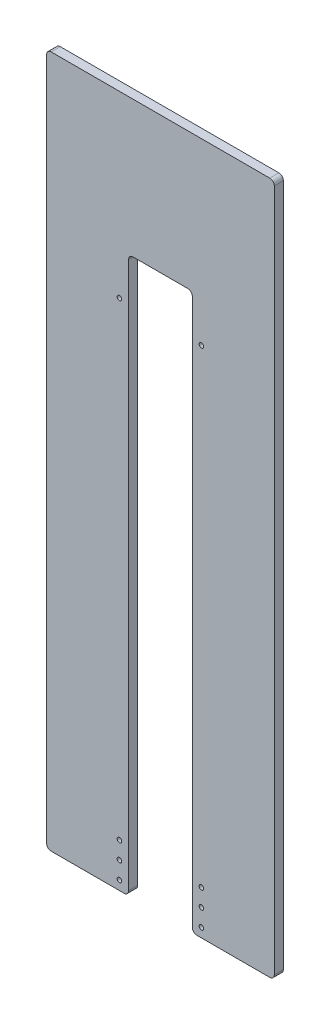
ISO-10303-21;
HEADER;
FILE_DESCRIPTION(('STEP AP214'),'2;1');
FILE_NAME('part.step','',(''),(''),'','','');
FILE_SCHEMA(('AUTOMOTIVE_DESIGN { 1 0 10303 214 1 1 1 1 }'));
ENDSEC;
DATA;
#1=APPLICATION_CONTEXT('core data for automotive mechanical design processes');
#2=APPLICATION_PROTOCOL_DEFINITION('international standard','automotive_design',2000,#1);
#3=PRODUCT_CONTEXT('',#1,'mechanical');
#4=PRODUCT('Part','Part','',(#3));
#5=PRODUCT_RELATED_PRODUCT_CATEGORY('part','',(#4));
#6=PRODUCT_DEFINITION_FORMATION('','',#4);
#7=PRODUCT_DEFINITION_CONTEXT('part definition',#1,'design');
#8=PRODUCT_DEFINITION('design','',#6,#7);
#9=PRODUCT_DEFINITION_SHAPE('','',#8);
#10=(LENGTH_UNIT() NAMED_UNIT(*) SI_UNIT(.MILLI.,.METRE.));
#11=(NAMED_UNIT(*) PLANE_ANGLE_UNIT() SI_UNIT($,.RADIAN.));
#12=(NAMED_UNIT(*) SI_UNIT($,.STERADIAN.) SOLID_ANGLE_UNIT());
#13=UNCERTAINTY_MEASURE_WITH_UNIT(LENGTH_MEASURE(1.E-05),#10,'distance_accuracy_value','');
#14=(GEOMETRIC_REPRESENTATION_CONTEXT(3) GLOBAL_UNCERTAINTY_ASSIGNED_CONTEXT((#13)) GLOBAL_UNIT_ASSIGNED_CONTEXT((#10,
#11,#12)) REPRESENTATION_CONTEXT('',''));
#15=CARTESIAN_POINT('',(0.,0.,0.));
#16=DIRECTION('',(0.,0.,1.));
#17=DIRECTION('',(1.,0.,0.));
#18=AXIS2_PLACEMENT_3D('',#15,#16,#17);
#19=CARTESIAN_POINT('',(40.,-5.,10.));
#20=DIRECTION('',(0.,0.,-1.));
#21=DIRECTION('',(-1.,0.,0.));
#22=AXIS2_PLACEMENT_3D('',#19,#20,#21);
#23=CYLINDRICAL_SURFACE('',#22,5.);
#24=CARTESIAN_POINT('',(40.,-5.,0.));
#25=DIRECTION('',(0.,0.,1.));
#26=DIRECTION('',(1.,0.,0.));
#27=AXIS2_PLACEMENT_3D('',#24,#25,#26);
#28=CIRCLE('',#27,5.);
#29=CARTESIAN_POINT('',(45.,-5.,0.));
#30=VERTEX_POINT('',#29);
#31=CARTESIAN_POINT('',(40.,0.,0.));
#32=VERTEX_POINT('',#31);
#33=EDGE_CURVE('E177',#30,#32,#28,.T.);
#34=ORIENTED_EDGE('',*,*,#33,.T.);
#35=DIRECTION('',(0.,0.,-1.));
#36=VECTOR('',#35,1.);
#37=CARTESIAN_POINT('',(40.,0.,10.));
#38=LINE('',#37,#36);
#39=CARTESIAN_POINT('',(40.,0.,10.));
#40=VERTEX_POINT('',#39);
#41=EDGE_CURVE('E11',#40,#32,#38,.T.);
#42=ORIENTED_EDGE('',*,*,#41,.F.);
#43=CARTESIAN_POINT('',(40.,-5.,10.));
#44=DIRECTION('',(0.,0.,1.));
#45=DIRECTION('',(1.,0.,0.));
#46=AXIS2_PLACEMENT_3D('',#43,#44,#45);
#47=CIRCLE('',#46,5.);
#48=CARTESIAN_POINT('',(45.,-5.,10.));
#49=VERTEX_POINT('',#48);
#50=EDGE_CURVE('E208',#49,#40,#47,.T.);
#51=ORIENTED_EDGE('',*,*,#50,.F.);
#52=DIRECTION('',(0.,0.,-1.));
#53=VECTOR('',#52,1.);
#54=CARTESIAN_POINT('',(45.,-5.,10.));
#55=LINE('',#54,#53);
#56=EDGE_CURVE('E173',#49,#30,#55,.T.);
#57=ORIENTED_EDGE('',*,*,#56,.T.);
#58=EDGE_LOOP('',(#34,#42,#51,#57));
#59=FACE_BOUND('',#58,.T.);
#60=ADVANCED_FACE('F33',(#59),#23,.T.);
#61=CARTESIAN_POINT('',(40.,0.,10.));
#62=DIRECTION('',(0.,-1.,0.));
#63=DIRECTION('',(1.,0.,0.));
#64=AXIS2_PLACEMENT_3D('',#61,#62,#63);
#65=PLANE('',#64);
#66=DIRECTION('',(-1.,0.,0.));
#67=VECTOR('',#66,1.);
#68=CARTESIAN_POINT('',(40.,0.,0.));
#69=LINE('',#68,#67);
#70=CARTESIAN_POINT('',(-200.,0.,0.));
#71=VERTEX_POINT('',#70);
#72=EDGE_CURVE('E180',#32,#71,#69,.T.);
#73=ORIENTED_EDGE('',*,*,#72,.T.);
#74=DIRECTION('',(0.,0.,-1.));
#75=VECTOR('',#74,1.);
#76=CARTESIAN_POINT('',(-200.,0.,10.));
#77=LINE('',#76,#75);
#78=CARTESIAN_POINT('',(-200.,0.,10.));
#79=VERTEX_POINT('',#78);
#80=EDGE_CURVE('E41',#79,#71,#77,.T.);
#81=ORIENTED_EDGE('',*,*,#80,.F.);
#82=DIRECTION('',(-1.,0.,0.));
#83=VECTOR('',#82,1.);
#84=CARTESIAN_POINT('',(40.,0.,10.));
#85=LINE('',#84,#83);
#86=EDGE_CURVE('E116',#40,#79,#85,.T.);
#87=ORIENTED_EDGE('',*,*,#86,.F.);
#88=ORIENTED_EDGE('',*,*,#41,.T.);
#89=EDGE_LOOP('',(#73,#81,#87,#88));
#90=FACE_BOUND('',#89,.T.);
#91=ADVANCED_FACE('F308',(#90),#65,.F.);
#92=CARTESIAN_POINT('',(-200.,-5.,10.));
#93=DIRECTION('',(0.,0.,-1.));
#94=DIRECTION('',(-1.,0.,0.));
#95=AXIS2_PLACEMENT_3D('',#92,#93,#94);
#96=CYLINDRICAL_SURFACE('',#95,4.99999999999999);
#97=CARTESIAN_POINT('',(-200.,-5.,0.));
#98=DIRECTION('',(0.,0.,1.));
#99=DIRECTION('',(1.,0.,0.));
#100=AXIS2_PLACEMENT_3D('',#97,#98,#99);
#101=CIRCLE('',#100,4.99999999999999);
#102=CARTESIAN_POINT('',(-205.,-5.,0.));
#103=VERTEX_POINT('',#102);
#104=EDGE_CURVE('E183',#71,#103,#101,.T.);
#105=ORIENTED_EDGE('',*,*,#104,.T.);
#106=DIRECTION('',(0.,0.,-1.));
#107=VECTOR('',#106,1.);
#108=CARTESIAN_POINT('',(-205.,-5.,10.));
#109=LINE('',#108,#107);
#110=CARTESIAN_POINT('',(-205.,-5.,10.));
#111=VERTEX_POINT('',#110);
#112=EDGE_CURVE('E239',#111,#103,#109,.T.);
#113=ORIENTED_EDGE('',*,*,#112,.F.);
#114=CARTESIAN_POINT('',(-200.,-5.,10.));
#115=DIRECTION('',(0.,0.,1.));
#116=DIRECTION('',(1.,0.,0.));
#117=AXIS2_PLACEMENT_3D('',#114,#115,#116);
#118=CIRCLE('',#117,4.99999999999999);
#119=EDGE_CURVE('E247',#79,#111,#118,.T.);
#120=ORIENTED_EDGE('',*,*,#119,.F.);
#121=ORIENTED_EDGE('',*,*,#80,.T.);
#122=EDGE_LOOP('',(#105,#113,#120,#121));
#123=FACE_BOUND('',#122,.T.);
#124=ADVANCED_FACE('F245',(#123),#96,.T.);
#125=CARTESIAN_POINT('',(-205.,-755.,10.));
#126=DIRECTION('',(1.,0.,0.));
#127=DIRECTION('',(0.,0.,-1.));
#128=AXIS2_PLACEMENT_3D('',#125,#126,#127);
#129=PLANE('',#128);
#130=DIRECTION('',(0.,-1.,0.));
#131=VECTOR('',#130,1.);
#132=CARTESIAN_POINT('',(-205.,-755.,0.));
#133=LINE('',#132,#131);
#134=CARTESIAN_POINT('',(-205.,-755.,0.));
#135=VERTEX_POINT('',#134);
#136=EDGE_CURVE('E185',#103,#135,#133,.T.);
#137=ORIENTED_EDGE('',*,*,#136,.T.);
#138=DIRECTION('',(0.,0.,-1.));
#139=VECTOR('',#138,1.);
#140=CARTESIAN_POINT('',(-205.,-755.,10.));
#141=LINE('',#140,#139);
#142=CARTESIAN_POINT('',(-205.,-755.,10.));
#143=VERTEX_POINT('',#142);
#144=EDGE_CURVE('E236',#143,#135,#141,.T.);
#145=ORIENTED_EDGE('',*,*,#144,.F.);
#146=DIRECTION('',(0.,-1.,0.));
#147=VECTOR('',#146,1.);
#148=CARTESIAN_POINT('',(-205.,-755.,10.));
#149=LINE('',#148,#147);
#150=EDGE_CURVE('E265',#111,#143,#149,.T.);
#151=ORIENTED_EDGE('',*,*,#150,.F.);
#152=ORIENTED_EDGE('',*,*,#112,.T.);
#153=EDGE_LOOP('',(#137,#145,#151,#152));
#154=FACE_BOUND('',#153,.T.);
#155=ADVANCED_FACE('F256',(#154),#129,.F.);
#156=CARTESIAN_POINT('',(-200.,-755.,10.));
#157=DIRECTION('',(0.,0.,-1.));
#158=DIRECTION('',(-1.,0.,0.));
#159=AXIS2_PLACEMENT_3D('',#156,#157,#158);
#160=CYLINDRICAL_SURFACE('',#159,4.99999999999995);
#161=CARTESIAN_POINT('',(-200.,-755.,0.));
#162=DIRECTION('',(0.,0.,1.));
#163=DIRECTION('',(-1.,0.,0.));
#164=AXIS2_PLACEMENT_3D('',#161,#162,#163);
#165=CIRCLE('',#164,4.99999999999995);
#166=CARTESIAN_POINT('',(-200.,-760.,0.));
#167=VERTEX_POINT('',#166);
#168=EDGE_CURVE('E187',#135,#167,#165,.T.);
#169=ORIENTED_EDGE('',*,*,#168,.T.);
#170=DIRECTION('',(0.,0.,-1.));
#171=VECTOR('',#170,1.);
#172=CARTESIAN_POINT('',(-200.,-760.,10.));
#173=LINE('',#172,#171);
#174=CARTESIAN_POINT('',(-200.,-760.,10.));
#175=VERTEX_POINT('',#174);
#176=EDGE_CURVE('E233',#175,#167,#173,.T.);
#177=ORIENTED_EDGE('',*,*,#176,.F.);
#178=CARTESIAN_POINT('',(-200.,-755.,10.));
#179=DIRECTION('',(0.,0.,1.));
#180=DIRECTION('',(-1.,0.,0.));
#181=AXIS2_PLACEMENT_3D('',#178,#179,#180);
#182=CIRCLE('',#181,4.99999999999995);
#183=EDGE_CURVE('E262',#143,#175,#182,.T.);
#184=ORIENTED_EDGE('',*,*,#183,.F.);
#185=ORIENTED_EDGE('',*,*,#144,.T.);
#186=EDGE_LOOP('',(#169,#177,#184,#185));
#187=FACE_BOUND('',#186,.T.);
#188=ADVANCED_FACE('F260',(#187),#160,.T.);
#189=CARTESIAN_POINT('',(-120.,-760.,10.));
#190=DIRECTION('',(0.,1.,0.));
#191=DIRECTION('',(0.,0.,1.));
#192=AXIS2_PLACEMENT_3D('',#189,#190,#191);
#193=PLANE('',#192);
#194=DIRECTION('',(1.,0.,0.));
#195=VECTOR('',#194,1.);
#196=CARTESIAN_POINT('',(-120.,-760.,0.));
#197=LINE('',#196,#195);
#198=CARTESIAN_POINT('',(-120.,-760.,0.));
#199=VERTEX_POINT('',#198);
#200=EDGE_CURVE('E189',#167,#199,#197,.T.);
#201=ORIENTED_EDGE('',*,*,#200,.T.);
#202=DIRECTION('',(0.,0.,-1.));
#203=VECTOR('',#202,1.);
#204=CARTESIAN_POINT('',(-120.,-760.,10.));
#205=LINE('',#204,#203);
#206=CARTESIAN_POINT('',(-120.,-760.,10.));
#207=VERTEX_POINT('',#206);
#208=EDGE_CURVE('E230',#207,#199,#205,.T.);
#209=ORIENTED_EDGE('',*,*,#208,.F.);
#210=DIRECTION('',(1.,0.,0.));
#211=VECTOR('',#210,1.);
#212=CARTESIAN_POINT('',(-120.,-760.,10.));
#213=LINE('',#212,#211);
#214=EDGE_CURVE('E264',#175,#207,#213,.T.);
#215=ORIENTED_EDGE('',*,*,#214,.F.);
#216=ORIENTED_EDGE('',*,*,#176,.T.);
#217=EDGE_LOOP('',(#201,#209,#215,#216));
#218=FACE_BOUND('',#217,.T.);
#219=ADVANCED_FACE('F321',(#218),#193,.F.);
#220=CARTESIAN_POINT('',(-120.,-755.,10.));
#221=DIRECTION('',(0.,0.,-1.));
#222=DIRECTION('',(-1.,0.,0.));
#223=AXIS2_PLACEMENT_3D('',#220,#221,#222);
#224=CYLINDRICAL_SURFACE('',#223,4.99999999999996);
#225=CARTESIAN_POINT('',(-120.,-755.,0.));
#226=DIRECTION('',(0.,0.,1.));
#227=DIRECTION('',(-1.,0.,0.));
#228=AXIS2_PLACEMENT_3D('',#225,#226,#227);
#229=CIRCLE('',#228,4.99999999999996);
#230=CARTESIAN_POINT('',(-115.,-755.,0.));
#231=VERTEX_POINT('',#230);
#232=EDGE_CURVE('E191',#199,#231,#229,.T.);
#233=ORIENTED_EDGE('',*,*,#232,.T.);
#234=DIRECTION('',(0.,0.,-1.));
#235=VECTOR('',#234,1.);
#236=CARTESIAN_POINT('',(-115.,-755.,10.));
#237=LINE('',#236,#235);
#238=CARTESIAN_POINT('',(-115.,-755.,10.));
#239=VERTEX_POINT('',#238);
#240=EDGE_CURVE('E227',#239,#231,#237,.T.);
#241=ORIENTED_EDGE('',*,*,#240,.F.);
#242=CARTESIAN_POINT('',(-120.,-755.,10.));
#243=DIRECTION('',(0.,0.,1.));
#244=DIRECTION('',(-1.,0.,0.));
#245=AXIS2_PLACEMENT_3D('',#242,#243,#244);
#246=CIRCLE('',#245,4.99999999999996);
#247=EDGE_CURVE('E267',#207,#239,#246,.T.);
#248=ORIENTED_EDGE('',*,*,#247,.F.);
#249=ORIENTED_EDGE('',*,*,#208,.T.);
#250=EDGE_LOOP('',(#233,#241,#248,#249));
#251=FACE_BOUND('',#250,.T.);
#252=ADVANCED_FACE('F324',(#251),#224,.T.);
#253=CARTESIAN_POINT('',(-115.,-755.,10.));
#254=DIRECTION('',(-1.,0.,0.));
#255=DIRECTION('',(0.,-1.,0.));
#256=AXIS2_PLACEMENT_3D('',#253,#254,#255);
#257=PLANE('',#256);
#258=DIRECTION('',(0.,1.,0.));
#259=VECTOR('',#258,1.);
#260=CARTESIAN_POINT('',(-115.,-755.,0.));
#261=LINE('',#260,#259);
#262=CARTESIAN_POINT('',(-115.,-155.,0.));
#263=VERTEX_POINT('',#262);
#264=EDGE_CURVE('E193',#231,#263,#261,.T.);
#265=ORIENTED_EDGE('',*,*,#264,.T.);
#266=DIRECTION('',(0.,0.,-1.));
#267=VECTOR('',#266,1.);
#268=CARTESIAN_POINT('',(-115.,-155.,10.));
#269=LINE('',#268,#267);
#270=CARTESIAN_POINT('',(-115.,-155.,10.));
#271=VERTEX_POINT('',#270);
#272=EDGE_CURVE('E224',#271,#263,#269,.T.);
#273=ORIENTED_EDGE('',*,*,#272,.F.);
#274=DIRECTION('',(0.,1.,0.));
#275=VECTOR('',#274,1.);
#276=CARTESIAN_POINT('',(-115.,-755.,10.));
#277=LINE('',#276,#275);
#278=EDGE_CURVE('E273',#239,#271,#277,.T.);
#279=ORIENTED_EDGE('',*,*,#278,.F.);
#280=ORIENTED_EDGE('',*,*,#240,.T.);
#281=EDGE_LOOP('',(#265,#273,#279,#280));
#282=FACE_BOUND('',#281,.T.);
#283=ADVANCED_FACE('F328',(#282),#257,.F.);
#284=CARTESIAN_POINT('',(-110.,-155.,10.));
#285=DIRECTION('',(0.,0.,-1.));
#286=DIRECTION('',(-1.,0.,0.));
#287=AXIS2_PLACEMENT_3D('',#284,#285,#286);
#288=CYLINDRICAL_SURFACE('',#287,5.00000000000001);
#289=CARTESIAN_POINT('',(-110.,-155.,0.));
#290=DIRECTION('',(0.,0.,-1.));
#291=DIRECTION('',(1.,0.,0.));
#292=AXIS2_PLACEMENT_3D('',#289,#290,#291);
#293=CIRCLE('',#292,5.00000000000001);
#294=CARTESIAN_POINT('',(-110.,-150.,0.));
#295=VERTEX_POINT('',#294);
#296=EDGE_CURVE('E195',#263,#295,#293,.T.);
#297=ORIENTED_EDGE('',*,*,#296,.T.);
#298=DIRECTION('',(0.,0.,-1.));
#299=VECTOR('',#298,1.);
#300=CARTESIAN_POINT('',(-110.,-150.,10.));
#301=LINE('',#300,#299);
#302=CARTESIAN_POINT('',(-110.,-150.,10.));
#303=VERTEX_POINT('',#302);
#304=EDGE_CURVE('E221',#303,#295,#301,.T.);
#305=ORIENTED_EDGE('',*,*,#304,.F.);
#306=CARTESIAN_POINT('',(-110.,-155.,10.));
#307=DIRECTION('',(0.,0.,-1.));
#308=DIRECTION('',(1.,0.,0.));
#309=AXIS2_PLACEMENT_3D('',#306,#307,#308);
#310=CIRCLE('',#309,5.00000000000001);
#311=EDGE_CURVE('E275',#271,#303,#310,.T.);
#312=ORIENTED_EDGE('',*,*,#311,.F.);
#313=ORIENTED_EDGE('',*,*,#272,.T.);
#314=EDGE_LOOP('',(#297,#305,#312,#313));
#315=FACE_BOUND('',#314,.T.);
#316=ADVANCED_FACE('F332',(#315),#288,.F.);
#317=CARTESIAN_POINT('',(-50.,-150.,10.));
#318=DIRECTION('',(0.,1.,0.));
#319=DIRECTION('',(-1.,0.,0.));
#320=AXIS2_PLACEMENT_3D('',#317,#318,#319);
#321=PLANE('',#320);
#322=DIRECTION('',(1.,0.,0.));
#323=VECTOR('',#322,1.);
#324=CARTESIAN_POINT('',(-50.,-150.,0.));
#325=LINE('',#324,#323);
#326=CARTESIAN_POINT('',(-50.,-150.,0.));
#327=VERTEX_POINT('',#326);
#328=EDGE_CURVE('E197',#295,#327,#325,.T.);
#329=ORIENTED_EDGE('',*,*,#328,.T.);
#330=DIRECTION('',(0.,0.,-1.));
#331=VECTOR('',#330,1.);
#332=CARTESIAN_POINT('',(-50.,-150.,10.));
#333=LINE('',#332,#331);
#334=CARTESIAN_POINT('',(-50.,-150.,10.));
#335=VERTEX_POINT('',#334);
#336=EDGE_CURVE('E218',#335,#327,#333,.T.);
#337=ORIENTED_EDGE('',*,*,#336,.F.);
#338=DIRECTION('',(1.,0.,0.));
#339=VECTOR('',#338,1.);
#340=CARTESIAN_POINT('',(-50.,-150.,10.));
#341=LINE('',#340,#339);
#342=EDGE_CURVE('E277',#303,#335,#341,.T.);
#343=ORIENTED_EDGE('',*,*,#342,.F.);
#344=ORIENTED_EDGE('',*,*,#304,.T.);
#345=EDGE_LOOP('',(#329,#337,#343,#344));
#346=FACE_BOUND('',#345,.T.);
#347=ADVANCED_FACE('F336',(#346),#321,.F.);
#348=CARTESIAN_POINT('',(-50.,-155.,10.));
#349=DIRECTION('',(0.,0.,-1.));
#350=DIRECTION('',(-1.,0.,0.));
#351=AXIS2_PLACEMENT_3D('',#348,#349,#350);
#352=CYLINDRICAL_SURFACE('',#351,5.);
#353=CARTESIAN_POINT('',(-50.,-155.,0.));
#354=DIRECTION('',(0.,0.,-1.));
#355=DIRECTION('',(1.,0.,0.));
#356=AXIS2_PLACEMENT_3D('',#353,#354,#355);
#357=CIRCLE('',#356,5.);
#358=CARTESIAN_POINT('',(-45.,-155.,0.));
#359=VERTEX_POINT('',#358);
#360=EDGE_CURVE('E199',#327,#359,#357,.T.);
#361=ORIENTED_EDGE('',*,*,#360,.T.);
#362=DIRECTION('',(0.,0.,-1.));
#363=VECTOR('',#362,1.);
#364=CARTESIAN_POINT('',(-45.,-155.,10.));
#365=LINE('',#364,#363);
#366=CARTESIAN_POINT('',(-45.,-155.,10.));
#367=VERTEX_POINT('',#366);
#368=EDGE_CURVE('E215',#367,#359,#365,.T.);
#369=ORIENTED_EDGE('',*,*,#368,.F.);
#370=CARTESIAN_POINT('',(-50.,-155.,10.));
#371=DIRECTION('',(0.,0.,-1.));
#372=DIRECTION('',(1.,0.,0.));
#373=AXIS2_PLACEMENT_3D('',#370,#371,#372);
#374=CIRCLE('',#373,5.);
#375=EDGE_CURVE('E279',#335,#367,#374,.T.);
#376=ORIENTED_EDGE('',*,*,#375,.F.);
#377=ORIENTED_EDGE('',*,*,#336,.T.);
#378=EDGE_LOOP('',(#361,#369,#376,#377));
#379=FACE_BOUND('',#378,.T.);
#380=ADVANCED_FACE('F340',(#379),#352,.F.);
#381=CARTESIAN_POINT('',(-45.,-755.,10.));
#382=DIRECTION('',(1.,0.,0.));
#383=DIRECTION('',(0.,1.,0.));
#384=AXIS2_PLACEMENT_3D('',#381,#382,#383);
#385=PLANE('',#384);
#386=DIRECTION('',(0.,-1.,0.));
#387=VECTOR('',#386,1.);
#388=CARTESIAN_POINT('',(-45.,-755.,0.));
#389=LINE('',#388,#387);
#390=CARTESIAN_POINT('',(-45.,-755.,0.));
#391=VERTEX_POINT('',#390);
#392=EDGE_CURVE('E201',#359,#391,#389,.T.);
#393=ORIENTED_EDGE('',*,*,#392,.T.);
#394=DIRECTION('',(0.,0.,-1.));
#395=VECTOR('',#394,1.);
#396=CARTESIAN_POINT('',(-45.,-755.,10.));
#397=LINE('',#396,#395);
#398=CARTESIAN_POINT('',(-45.,-755.,10.));
#399=VERTEX_POINT('',#398);
#400=EDGE_CURVE('E212',#399,#391,#397,.T.);
#401=ORIENTED_EDGE('',*,*,#400,.F.);
#402=DIRECTION('',(0.,-1.,0.));
#403=VECTOR('',#402,1.);
#404=CARTESIAN_POINT('',(-45.,-755.,10.));
#405=LINE('',#404,#403);
#406=EDGE_CURVE('E281',#367,#399,#405,.T.);
#407=ORIENTED_EDGE('',*,*,#406,.F.);
#408=ORIENTED_EDGE('',*,*,#368,.T.);
#409=EDGE_LOOP('',(#393,#401,#407,#408));
#410=FACE_BOUND('',#409,.T.);
#411=ADVANCED_FACE('F287',(#410),#385,.F.);
#412=CARTESIAN_POINT('',(-40.,-755.,10.));
#413=DIRECTION('',(0.,0.,-1.));
#414=DIRECTION('',(-1.,0.,0.));
#415=AXIS2_PLACEMENT_3D('',#412,#413,#414);
#416=CYLINDRICAL_SURFACE('',#415,5.);
#417=CARTESIAN_POINT('',(-40.,-755.,0.));
#418=DIRECTION('',(0.,0.,1.));
#419=DIRECTION('',(1.,0.,0.));
#420=AXIS2_PLACEMENT_3D('',#417,#418,#419);
#421=CIRCLE('',#420,5.);
#422=CARTESIAN_POINT('',(-40.,-760.,0.));
#423=VERTEX_POINT('',#422);
#424=EDGE_CURVE('E203',#391,#423,#421,.T.);
#425=ORIENTED_EDGE('',*,*,#424,.T.);
#426=DIRECTION('',(0.,0.,-1.));
#427=VECTOR('',#426,1.);
#428=CARTESIAN_POINT('',(-40.,-760.,10.));
#429=LINE('',#428,#427);
#430=CARTESIAN_POINT('',(-40.,-760.,10.));
#431=VERTEX_POINT('',#430);
#432=EDGE_CURVE('E168',#431,#423,#429,.T.);
#433=ORIENTED_EDGE('',*,*,#432,.F.);
#434=CARTESIAN_POINT('',(-40.,-755.,10.));
#435=DIRECTION('',(0.,0.,1.));
#436=DIRECTION('',(1.,0.,0.));
#437=AXIS2_PLACEMENT_3D('',#434,#435,#436);
#438=CIRCLE('',#437,5.);
#439=EDGE_CURVE('E159',#399,#431,#438,.T.);
#440=ORIENTED_EDGE('',*,*,#439,.F.);
#441=ORIENTED_EDGE('',*,*,#400,.T.);
#442=EDGE_LOOP('',(#425,#433,#440,#441));
#443=FACE_BOUND('',#442,.T.);
#444=ADVANCED_FACE('F291',(#443),#416,.T.);
#445=CARTESIAN_POINT('',(40.,-760.,10.));
#446=DIRECTION('',(0.,1.,0.));
#447=DIRECTION('',(-1.,0.,0.));
#448=AXIS2_PLACEMENT_3D('',#445,#446,#447);
#449=PLANE('',#448);
#450=DIRECTION('',(1.,0.,0.));
#451=VECTOR('',#450,1.);
#452=CARTESIAN_POINT('',(40.,-760.,0.));
#453=LINE('',#452,#451);
#454=CARTESIAN_POINT('',(40.,-760.,0.));
#455=VERTEX_POINT('',#454);
#456=EDGE_CURVE('E167',#423,#455,#453,.T.);
#457=ORIENTED_EDGE('',*,*,#456,.T.);
#458=DIRECTION('',(0.,0.,-1.));
#459=VECTOR('',#458,1.);
#460=CARTESIAN_POINT('',(40.,-760.,10.));
#461=LINE('',#460,#459);
#462=CARTESIAN_POINT('',(40.,-760.,10.));
#463=VERTEX_POINT('',#462);
#464=EDGE_CURVE('E164',#463,#455,#461,.T.);
#465=ORIENTED_EDGE('',*,*,#464,.F.);
#466=DIRECTION('',(1.,0.,0.));
#467=VECTOR('',#466,1.);
#468=CARTESIAN_POINT('',(40.,-760.,10.));
#469=LINE('',#468,#467);
#470=EDGE_CURVE('E153',#431,#463,#469,.T.);
#471=ORIENTED_EDGE('',*,*,#470,.F.);
#472=ORIENTED_EDGE('',*,*,#432,.T.);
#473=EDGE_LOOP('',(#457,#465,#471,#472));
#474=FACE_BOUND('',#473,.T.);
#475=ADVANCED_FACE('F165',(#474),#449,.F.);
#476=CARTESIAN_POINT('',(40.,-755.,10.));
#477=DIRECTION('',(0.,0.,-1.));
#478=DIRECTION('',(-1.,0.,0.));
#479=AXIS2_PLACEMENT_3D('',#476,#477,#478);
#480=CYLINDRICAL_SURFACE('',#479,4.99999999999995);
#481=CARTESIAN_POINT('',(40.,-755.,0.));
#482=DIRECTION('',(0.,0.,1.));
#483=DIRECTION('',(1.,0.,0.));
#484=AXIS2_PLACEMENT_3D('',#481,#482,#483);
#485=CIRCLE('',#484,4.99999999999995);
#486=CARTESIAN_POINT('',(45.,-755.,0.));
#487=VERTEX_POINT('',#486);
#488=EDGE_CURVE('E102',#455,#487,#485,.T.);
#489=ORIENTED_EDGE('',*,*,#488,.T.);
#490=DIRECTION('',(0.,0.,-1.));
#491=VECTOR('',#490,1.);
#492=CARTESIAN_POINT('',(45.,-755.,10.));
#493=LINE('',#492,#491);
#494=CARTESIAN_POINT('',(45.,-755.,10.));
#495=VERTEX_POINT('',#494);
#496=EDGE_CURVE('E169',#495,#487,#493,.T.);
#497=ORIENTED_EDGE('',*,*,#496,.F.);
#498=CARTESIAN_POINT('',(40.,-755.,10.));
#499=DIRECTION('',(0.,0.,1.));
#500=DIRECTION('',(1.,0.,0.));
#501=AXIS2_PLACEMENT_3D('',#498,#499,#500);
#502=CIRCLE('',#501,4.99999999999995);
#503=EDGE_CURVE('E157',#463,#495,#502,.T.);
#504=ORIENTED_EDGE('',*,*,#503,.F.);
#505=ORIENTED_EDGE('',*,*,#464,.T.);
#506=EDGE_LOOP('',(#489,#497,#504,#505));
#507=FACE_BOUND('',#506,.T.);
#508=ADVANCED_FACE('F171',(#507),#480,.T.);
#509=CARTESIAN_POINT('',(45.,-755.,10.));
#510=DIRECTION('',(-1.,0.,0.));
#511=DIRECTION('',(0.,0.,1.));
#512=AXIS2_PLACEMENT_3D('',#509,#510,#511);
#513=PLANE('',#512);
#514=DIRECTION('',(0.,1.,0.));
#515=VECTOR('',#514,1.);
#516=CARTESIAN_POINT('',(45.,-755.,0.));
#517=LINE('',#516,#515);
#518=EDGE_CURVE('E108',#487,#30,#517,.T.);
#519=ORIENTED_EDGE('',*,*,#518,.T.);
#520=ORIENTED_EDGE('',*,*,#56,.F.);
#521=DIRECTION('',(0.,1.,0.));
#522=VECTOR('',#521,1.);
#523=CARTESIAN_POINT('',(45.,-755.,10.));
#524=LINE('',#523,#522);
#525=EDGE_CURVE('E49',#495,#49,#524,.T.);
#526=ORIENTED_EDGE('',*,*,#525,.F.);
#527=ORIENTED_EDGE('',*,*,#496,.T.);
#528=EDGE_LOOP('',(#519,#520,#526,#527));
#529=FACE_BOUND('',#528,.T.);
#530=ADVANCED_FACE('F295',(#529),#513,.F.);
#531=CARTESIAN_POINT('',(40.,-5.,10.));
#532=DIRECTION('',(0.,0.,1.));
#533=DIRECTION('',(1.,0.,0.));
#534=AXIS2_PLACEMENT_3D('',#531,#532,#533);
#535=PLANE('',#534);
#536=CARTESIAN_POINT('',(-35.,-196.585535827088,10.));
#537=DIRECTION('',(0.,0.,1.));
#538=DIRECTION('',(1.,0.,0.));
#539=AXIS2_PLACEMENT_3D('',#536,#537,#538);
#540=CIRCLE('',#539,2.49999999999998);
#541=CARTESIAN_POINT('',(-32.5,-196.585535827088,10.));
#542=VERTEX_POINT('',#541);
#543=EDGE_CURVE('E459',#542,#542,#540,.T.);
#544=ORIENTED_EDGE('',*,*,#543,.F.);
#545=EDGE_LOOP('',(#544));
#546=FACE_BOUND('',#545,.T.);
#547=CARTESIAN_POINT('',(-125.,-196.585535827088,10.));
#548=DIRECTION('',(0.,0.,1.));
#549=DIRECTION('',(1.,0.,0.));
#550=AXIS2_PLACEMENT_3D('',#547,#548,#549);
#551=CIRCLE('',#550,2.49999999999997);
#552=CARTESIAN_POINT('',(-122.5,-196.585535827088,10.));
#553=VERTEX_POINT('',#552);
#554=EDGE_CURVE('E469',#553,#553,#551,.T.);
#555=ORIENTED_EDGE('',*,*,#554,.F.);
#556=EDGE_LOOP('',(#555));
#557=FACE_BOUND('',#556,.T.);
#558=CARTESIAN_POINT('',(-35.,-750.,10.));
#559=DIRECTION('',(0.,0.,1.));
#560=DIRECTION('',(1.,0.,0.));
#561=AXIS2_PLACEMENT_3D('',#558,#559,#560);
#562=CIRCLE('',#561,2.49999999999998);
#563=CARTESIAN_POINT('',(-32.5,-750.,10.));
#564=VERTEX_POINT('',#563);
#565=EDGE_CURVE('E475',#564,#564,#562,.T.);
#566=ORIENTED_EDGE('',*,*,#565,.F.);
#567=EDGE_LOOP('',(#566));
#568=FACE_BOUND('',#567,.T.);
#569=CARTESIAN_POINT('',(-35.,-712.,10.));
#570=DIRECTION('',(0.,0.,1.));
#571=DIRECTION('',(1.,0.,0.));
#572=AXIS2_PLACEMENT_3D('',#569,#570,#571);
#573=CIRCLE('',#572,2.49999999999998);
#574=CARTESIAN_POINT('',(-32.5,-712.,10.));
#575=VERTEX_POINT('',#574);
#576=EDGE_CURVE('E481',#575,#575,#573,.T.);
#577=ORIENTED_EDGE('',*,*,#576,.F.);
#578=EDGE_LOOP('',(#577));
#579=FACE_BOUND('',#578,.T.);
#580=CARTESIAN_POINT('',(-125.,-750.,10.));
#581=DIRECTION('',(0.,0.,1.));
#582=DIRECTION('',(1.,0.,0.));
#583=AXIS2_PLACEMENT_3D('',#580,#581,#582);
#584=CIRCLE('',#583,2.49999999999997);
#585=CARTESIAN_POINT('',(-122.5,-750.,10.));
#586=VERTEX_POINT('',#585);
#587=EDGE_CURVE('E487',#586,#586,#584,.T.);
#588=ORIENTED_EDGE('',*,*,#587,.F.);
#589=EDGE_LOOP('',(#588));
#590=FACE_BOUND('',#589,.T.);
#591=CARTESIAN_POINT('',(-125.,-712.,10.));
#592=DIRECTION('',(0.,0.,1.));
#593=DIRECTION('',(1.,0.,0.));
#594=AXIS2_PLACEMENT_3D('',#591,#592,#593);
#595=CIRCLE('',#594,2.49999999999997);
#596=CARTESIAN_POINT('',(-122.5,-712.,10.));
#597=VERTEX_POINT('',#596);
#598=EDGE_CURVE('E493',#597,#597,#595,.T.);
#599=ORIENTED_EDGE('',*,*,#598,.F.);
#600=EDGE_LOOP('',(#599));
#601=FACE_BOUND('',#600,.T.);
#602=CARTESIAN_POINT('',(-35.,-731.,10.));
#603=DIRECTION('',(0.,0.,1.));
#604=DIRECTION('',(1.,0.,0.));
#605=AXIS2_PLACEMENT_3D('',#602,#603,#604);
#606=CIRCLE('',#605,2.49999999999998);
#607=CARTESIAN_POINT('',(-32.5,-731.,10.));
#608=VERTEX_POINT('',#607);
#609=EDGE_CURVE('E499',#608,#608,#606,.T.);
#610=ORIENTED_EDGE('',*,*,#609,.F.);
#611=EDGE_LOOP('',(#610));
#612=FACE_BOUND('',#611,.T.);
#613=CARTESIAN_POINT('',(-125.,-731.,10.));
#614=DIRECTION('',(0.,0.,1.));
#615=DIRECTION('',(1.,0.,0.));
#616=AXIS2_PLACEMENT_3D('',#613,#614,#615);
#617=CIRCLE('',#616,2.49999999999997);
#618=CARTESIAN_POINT('',(-122.5,-731.,10.));
#619=VERTEX_POINT('',#618);
#620=EDGE_CURVE('E181',#619,#619,#617,.T.);
#621=ORIENTED_EDGE('',*,*,#620,.F.);
#622=EDGE_LOOP('',(#621));
#623=FACE_BOUND('',#622,.T.);
#624=ORIENTED_EDGE('',*,*,#50,.T.);
#625=ORIENTED_EDGE('',*,*,#86,.T.);
#626=ORIENTED_EDGE('',*,*,#119,.T.);
#627=ORIENTED_EDGE('',*,*,#150,.T.);
#628=ORIENTED_EDGE('',*,*,#183,.T.);
#629=ORIENTED_EDGE('',*,*,#214,.T.);
#630=ORIENTED_EDGE('',*,*,#247,.T.);
#631=ORIENTED_EDGE('',*,*,#278,.T.);
#632=ORIENTED_EDGE('',*,*,#311,.T.);
#633=ORIENTED_EDGE('',*,*,#342,.T.);
#634=ORIENTED_EDGE('',*,*,#375,.T.);
#635=ORIENTED_EDGE('',*,*,#406,.T.);
#636=ORIENTED_EDGE('',*,*,#439,.T.);
#637=ORIENTED_EDGE('',*,*,#470,.T.);
#638=ORIENTED_EDGE('',*,*,#503,.T.);
#639=ORIENTED_EDGE('',*,*,#525,.T.);
#640=EDGE_LOOP('',(#624,#625,#626,#627,#628,#629,#630,#631,#632,#633,#634,#635,#636,#637,#638,#639));
#641=FACE_BOUND('',#640,.T.);
#642=ADVANCED_FACE('F155',(#546,#557,#568,#579,#590,#601,#612,#623,#641),#535,.T.);
#643=CARTESIAN_POINT('',(40.,-5.,0.));
#644=DIRECTION('',(0.,0.,1.));
#645=DIRECTION('',(1.,0.,0.));
#646=AXIS2_PLACEMENT_3D('',#643,#644,#645);
#647=PLANE('',#646);
#648=CARTESIAN_POINT('',(-35.,-196.585535827088,0.));
#649=DIRECTION('',(0.,0.,1.));
#650=DIRECTION('',(1.,0.,0.));
#651=AXIS2_PLACEMENT_3D('',#648,#649,#650);
#652=CIRCLE('',#651,2.49999999999997);
#653=CARTESIAN_POINT('',(-32.5,-196.585535827088,0.));
#654=VERTEX_POINT('',#653);
#655=EDGE_CURVE('E462',#654,#654,#652,.T.);
#656=ORIENTED_EDGE('',*,*,#655,.T.);
#657=EDGE_LOOP('',(#656));
#658=FACE_BOUND('',#657,.T.);
#659=CARTESIAN_POINT('',(-125.,-196.585535827088,0.));
#660=DIRECTION('',(0.,0.,1.));
#661=DIRECTION('',(1.,0.,0.));
#662=AXIS2_PLACEMENT_3D('',#659,#660,#661);
#663=CIRCLE('',#662,2.49999999999997);
#664=CARTESIAN_POINT('',(-122.5,-196.585535827088,0.));
#665=VERTEX_POINT('',#664);
#666=EDGE_CURVE('E464',#665,#665,#663,.T.);
#667=ORIENTED_EDGE('',*,*,#666,.T.);
#668=EDGE_LOOP('',(#667));
#669=FACE_BOUND('',#668,.T.);
#670=CARTESIAN_POINT('',(-35.,-750.,0.));
#671=DIRECTION('',(0.,0.,1.));
#672=DIRECTION('',(1.,0.,0.));
#673=AXIS2_PLACEMENT_3D('',#670,#671,#672);
#674=CIRCLE('',#673,2.49999999999997);
#675=CARTESIAN_POINT('',(-32.5,-750.,0.));
#676=VERTEX_POINT('',#675);
#677=EDGE_CURVE('E472',#676,#676,#674,.T.);
#678=ORIENTED_EDGE('',*,*,#677,.T.);
#679=EDGE_LOOP('',(#678));
#680=FACE_BOUND('',#679,.T.);
#681=CARTESIAN_POINT('',(-35.,-712.,0.));
#682=DIRECTION('',(0.,0.,1.));
#683=DIRECTION('',(1.,0.,0.));
#684=AXIS2_PLACEMENT_3D('',#681,#682,#683);
#685=CIRCLE('',#684,2.49999999999997);
#686=CARTESIAN_POINT('',(-32.5,-712.,0.));
#687=VERTEX_POINT('',#686);
#688=EDGE_CURVE('E478',#687,#687,#685,.T.);
#689=ORIENTED_EDGE('',*,*,#688,.T.);
#690=EDGE_LOOP('',(#689));
#691=FACE_BOUND('',#690,.T.);
#692=CARTESIAN_POINT('',(-125.,-750.,0.));
#693=DIRECTION('',(0.,0.,1.));
#694=DIRECTION('',(1.,0.,0.));
#695=AXIS2_PLACEMENT_3D('',#692,#693,#694);
#696=CIRCLE('',#695,2.49999999999997);
#697=CARTESIAN_POINT('',(-122.5,-750.,0.));
#698=VERTEX_POINT('',#697);
#699=EDGE_CURVE('E484',#698,#698,#696,.T.);
#700=ORIENTED_EDGE('',*,*,#699,.T.);
#701=EDGE_LOOP('',(#700));
#702=FACE_BOUND('',#701,.T.);
#703=CARTESIAN_POINT('',(-125.,-712.,0.));
#704=DIRECTION('',(0.,0.,1.));
#705=DIRECTION('',(1.,0.,0.));
#706=AXIS2_PLACEMENT_3D('',#703,#704,#705);
#707=CIRCLE('',#706,2.49999999999997);
#708=CARTESIAN_POINT('',(-122.5,-712.,0.));
#709=VERTEX_POINT('',#708);
#710=EDGE_CURVE('E490',#709,#709,#707,.T.);
#711=ORIENTED_EDGE('',*,*,#710,.T.);
#712=EDGE_LOOP('',(#711));
#713=FACE_BOUND('',#712,.T.);
#714=CARTESIAN_POINT('',(-35.,-731.,0.));
#715=DIRECTION('',(0.,0.,1.));
#716=DIRECTION('',(1.,0.,0.));
#717=AXIS2_PLACEMENT_3D('',#714,#715,#716);
#718=CIRCLE('',#717,2.49999999999997);
#719=CARTESIAN_POINT('',(-32.5,-731.,0.));
#720=VERTEX_POINT('',#719);
#721=EDGE_CURVE('E496',#720,#720,#718,.T.);
#722=ORIENTED_EDGE('',*,*,#721,.T.);
#723=EDGE_LOOP('',(#722));
#724=FACE_BOUND('',#723,.T.);
#725=CARTESIAN_POINT('',(-125.,-731.,0.));
#726=DIRECTION('',(0.,0.,1.));
#727=DIRECTION('',(1.,0.,0.));
#728=AXIS2_PLACEMENT_3D('',#725,#726,#727);
#729=CIRCLE('',#728,2.49999999999997);
#730=CARTESIAN_POINT('',(-122.5,-731.,0.));
#731=VERTEX_POINT('',#730);
#732=EDGE_CURVE('E502',#731,#731,#729,.T.);
#733=ORIENTED_EDGE('',*,*,#732,.T.);
#734=EDGE_LOOP('',(#733));
#735=FACE_BOUND('',#734,.T.);
#736=ORIENTED_EDGE('',*,*,#33,.F.);
#737=ORIENTED_EDGE('',*,*,#518,.F.);
#738=ORIENTED_EDGE('',*,*,#488,.F.);
#739=ORIENTED_EDGE('',*,*,#456,.F.);
#740=ORIENTED_EDGE('',*,*,#424,.F.);
#741=ORIENTED_EDGE('',*,*,#392,.F.);
#742=ORIENTED_EDGE('',*,*,#360,.F.);
#743=ORIENTED_EDGE('',*,*,#328,.F.);
#744=ORIENTED_EDGE('',*,*,#296,.F.);
#745=ORIENTED_EDGE('',*,*,#264,.F.);
#746=ORIENTED_EDGE('',*,*,#232,.F.);
#747=ORIENTED_EDGE('',*,*,#200,.F.);
#748=ORIENTED_EDGE('',*,*,#168,.F.);
#749=ORIENTED_EDGE('',*,*,#136,.F.);
#750=ORIENTED_EDGE('',*,*,#104,.F.);
#751=ORIENTED_EDGE('',*,*,#72,.F.);
#752=EDGE_LOOP('',(#736,#737,#738,#739,#740,#741,#742,#743,#744,#745,#746,#747,#748,#749,#750,#751));
#753=FACE_BOUND('',#752,.T.);
#754=ADVANCED_FACE('F251',(#658,#669,#680,#691,#702,#713,#724,#735,#753),#647,.F.);
#755=CARTESIAN_POINT('',(-125.,-731.,20.0000000000002));
#756=DIRECTION('',(0.,0.,1.));
#757=DIRECTION('',(1.,0.,0.));
#758=AXIS2_PLACEMENT_3D('',#755,#756,#757);
#759=CYLINDRICAL_SURFACE('',#758,2.49999999999997);
#760=ORIENTED_EDGE('',*,*,#620,.T.);
#761=EDGE_LOOP('',(#760));
#762=FACE_BOUND('',#761,.T.);
#763=ORIENTED_EDGE('',*,*,#732,.F.);
#764=EDGE_LOOP('',(#763));
#765=FACE_BOUND('',#764,.T.);
#766=ADVANCED_FACE('F374',(#762,#765),#759,.F.);
#767=CARTESIAN_POINT('',(-35.,-731.,20.0000000000002));
#768=DIRECTION('',(0.,0.,1.));
#769=DIRECTION('',(1.,0.,0.));
#770=AXIS2_PLACEMENT_3D('',#767,#768,#769);
#771=CYLINDRICAL_SURFACE('',#770,2.49999999999998);
#772=ORIENTED_EDGE('',*,*,#609,.T.);
#773=EDGE_LOOP('',(#772));
#774=FACE_BOUND('',#773,.T.);
#775=ORIENTED_EDGE('',*,*,#721,.F.);
#776=EDGE_LOOP('',(#775));
#777=FACE_BOUND('',#776,.T.);
#778=ADVANCED_FACE('F382',(#774,#777),#771,.F.);
#779=CARTESIAN_POINT('',(-125.,-712.,20.0000000000002));
#780=DIRECTION('',(0.,0.,1.));
#781=DIRECTION('',(1.,0.,0.));
#782=AXIS2_PLACEMENT_3D('',#779,#780,#781);
#783=CYLINDRICAL_SURFACE('',#782,2.49999999999997);
#784=ORIENTED_EDGE('',*,*,#598,.T.);
#785=EDGE_LOOP('',(#784));
#786=FACE_BOUND('',#785,.T.);
#787=ORIENTED_EDGE('',*,*,#710,.F.);
#788=EDGE_LOOP('',(#787));
#789=FACE_BOUND('',#788,.T.);
#790=ADVANCED_FACE('F392',(#786,#789),#783,.F.);
#791=CARTESIAN_POINT('',(-125.,-750.,20.0000000000002));
#792=DIRECTION('',(0.,0.,1.));
#793=DIRECTION('',(1.,0.,0.));
#794=AXIS2_PLACEMENT_3D('',#791,#792,#793);
#795=CYLINDRICAL_SURFACE('',#794,2.49999999999997);
#796=ORIENTED_EDGE('',*,*,#587,.T.);
#797=EDGE_LOOP('',(#796));
#798=FACE_BOUND('',#797,.T.);
#799=ORIENTED_EDGE('',*,*,#699,.F.);
#800=EDGE_LOOP('',(#799));
#801=FACE_BOUND('',#800,.T.);
#802=ADVANCED_FACE('F402',(#798,#801),#795,.F.);
#803=CARTESIAN_POINT('',(-35.,-712.,20.0000000000002));
#804=DIRECTION('',(0.,0.,1.));
#805=DIRECTION('',(1.,0.,0.));
#806=AXIS2_PLACEMENT_3D('',#803,#804,#805);
#807=CYLINDRICAL_SURFACE('',#806,2.49999999999998);
#808=ORIENTED_EDGE('',*,*,#576,.T.);
#809=EDGE_LOOP('',(#808));
#810=FACE_BOUND('',#809,.T.);
#811=ORIENTED_EDGE('',*,*,#688,.F.);
#812=EDGE_LOOP('',(#811));
#813=FACE_BOUND('',#812,.T.);
#814=ADVANCED_FACE('F412',(#810,#813),#807,.F.);
#815=CARTESIAN_POINT('',(-35.,-750.,20.0000000000002));
#816=DIRECTION('',(0.,0.,1.));
#817=DIRECTION('',(1.,0.,0.));
#818=AXIS2_PLACEMENT_3D('',#815,#816,#817);
#819=CYLINDRICAL_SURFACE('',#818,2.49999999999998);
#820=ORIENTED_EDGE('',*,*,#565,.T.);
#821=EDGE_LOOP('',(#820));
#822=FACE_BOUND('',#821,.T.);
#823=ORIENTED_EDGE('',*,*,#677,.F.);
#824=EDGE_LOOP('',(#823));
#825=FACE_BOUND('',#824,.T.);
#826=ADVANCED_FACE('F422',(#822,#825),#819,.F.);
#827=CARTESIAN_POINT('',(-125.,-196.585535827088,20.0000000000002));
#828=DIRECTION('',(0.,0.,1.));
#829=DIRECTION('',(1.,0.,0.));
#830=AXIS2_PLACEMENT_3D('',#827,#828,#829);
#831=CYLINDRICAL_SURFACE('',#830,2.49999999999997);
#832=ORIENTED_EDGE('',*,*,#554,.T.);
#833=EDGE_LOOP('',(#832));
#834=FACE_BOUND('',#833,.T.);
#835=ORIENTED_EDGE('',*,*,#666,.F.);
#836=EDGE_LOOP('',(#835));
#837=FACE_BOUND('',#836,.T.);
#838=ADVANCED_FACE('F432',(#834,#837),#831,.F.);
#839=CARTESIAN_POINT('',(-35.,-196.585535827088,20.0000000000002));
#840=DIRECTION('',(0.,0.,1.));
#841=DIRECTION('',(1.,0.,0.));
#842=AXIS2_PLACEMENT_3D('',#839,#840,#841);
#843=CYLINDRICAL_SURFACE('',#842,2.49999999999998);
#844=ORIENTED_EDGE('',*,*,#543,.T.);
#845=EDGE_LOOP('',(#844));
#846=FACE_BOUND('',#845,.T.);
#847=ORIENTED_EDGE('',*,*,#655,.F.);
#848=EDGE_LOOP('',(#847));
#849=FACE_BOUND('',#848,.T.);
#850=ADVANCED_FACE('F442',(#846,#849),#843,.F.);
#851=CLOSED_SHELL('',(#60,#91,#124,#155,#188,#219,#252,#283,#316,#347,#380,#411,#444,#475,#508,
#530,#642,#754,#766,#778,#790,#802,#814,#826,#838,#850));
#852=MANIFOLD_SOLID_BREP('B2',#851);
#853=ADVANCED_BREP_SHAPE_REPRESENTATION('',(#18,#852),#14);
#854=SHAPE_DEFINITION_REPRESENTATION(#9,#853);
ENDSEC;
END-ISO-10303-21;
